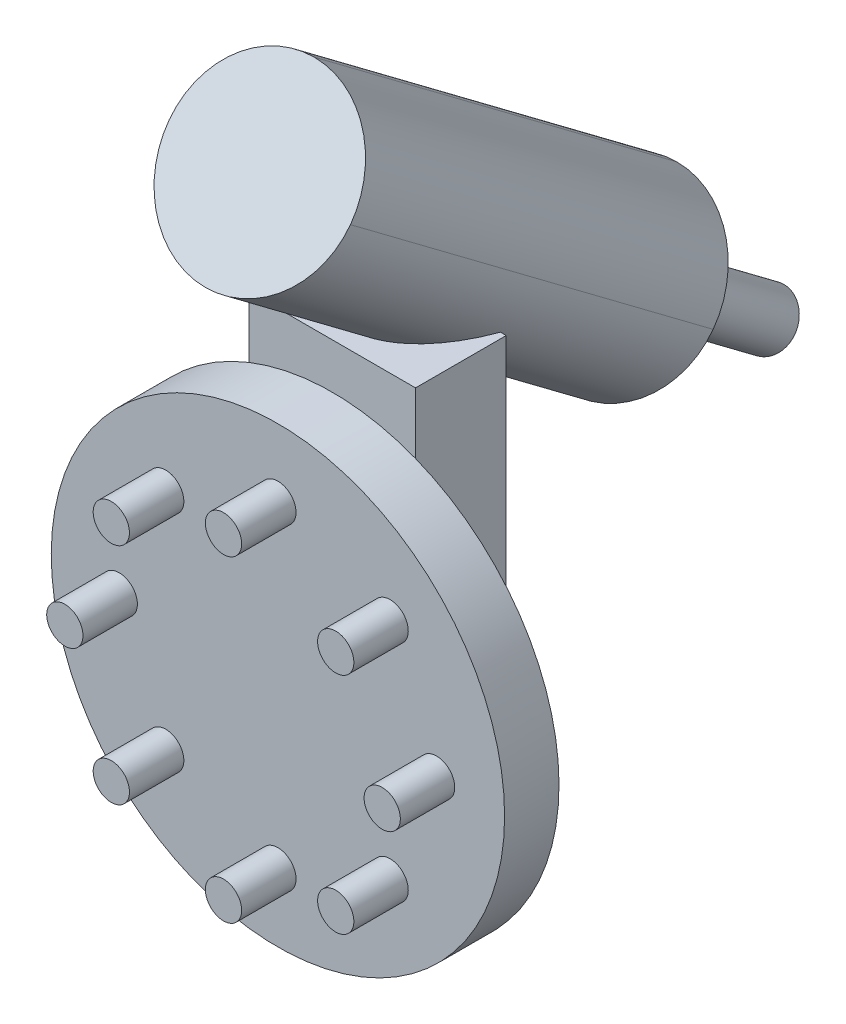
ISO-10303-21;
HEADER;
FILE_DESCRIPTION(('STEP AP214'),'2;1');
FILE_NAME('part.step','',(''),(''),'','','');
FILE_SCHEMA(('AUTOMOTIVE_DESIGN { 1 0 10303 214 1 1 1 1 }'));
ENDSEC;
DATA;
#1=APPLICATION_CONTEXT('core data for automotive mechanical design processes');
#2=APPLICATION_PROTOCOL_DEFINITION('international standard','automotive_design',2000,#1);
#3=PRODUCT_CONTEXT('',#1,'mechanical');
#4=PRODUCT('Part','Part','',(#3));
#5=PRODUCT_RELATED_PRODUCT_CATEGORY('part','',(#4));
#6=PRODUCT_DEFINITION_FORMATION('','',#4);
#7=PRODUCT_DEFINITION_CONTEXT('part definition',#1,'design');
#8=PRODUCT_DEFINITION('design','',#6,#7);
#9=PRODUCT_DEFINITION_SHAPE('','',#8);
#10=(LENGTH_UNIT() NAMED_UNIT(*) SI_UNIT(.MILLI.,.METRE.));
#11=(NAMED_UNIT(*) PLANE_ANGLE_UNIT() SI_UNIT($,.RADIAN.));
#12=(NAMED_UNIT(*) SI_UNIT($,.STERADIAN.) SOLID_ANGLE_UNIT());
#13=UNCERTAINTY_MEASURE_WITH_UNIT(LENGTH_MEASURE(1.E-05),#10,'distance_accuracy_value','');
#14=(GEOMETRIC_REPRESENTATION_CONTEXT(3) GLOBAL_UNCERTAINTY_ASSIGNED_CONTEXT((#13)) GLOBAL_UNIT_ASSIGNED_CONTEXT((#10,
#11,#12)) REPRESENTATION_CONTEXT('',''));
#15=CARTESIAN_POINT('',(0.,0.,0.));
#16=DIRECTION('',(0.,0.,1.));
#17=DIRECTION('',(1.,0.,0.));
#18=AXIS2_PLACEMENT_3D('',#15,#16,#17);
#19=CARTESIAN_POINT('',(0.,0.,0.));
#20=DIRECTION('',(0.,0.,1.));
#21=DIRECTION('',(1.,0.,0.));
#22=AXIS2_PLACEMENT_3D('',#19,#20,#21);
#23=PLANE('',#22);
#24=DIRECTION('',(0.,1.,0.));
#25=VECTOR('',#24,1.);
#26=CARTESIAN_POINT('',(-4.58789080822086,0.,0.));
#27=LINE('',#26,#25);
#28=CARTESIAN_POINT('',(-4.58789080822086,0.,0.));
#29=VERTEX_POINT('',#28);
#30=CARTESIAN_POINT('',(-4.58789080822086,11.6276075755868,0.));
#31=VERTEX_POINT('',#30);
#32=EDGE_CURVE('E160',#29,#31,#27,.T.);
#33=ORIENTED_EDGE('',*,*,#32,.F.);
#34=DIRECTION('',(-1.,0.,0.));
#35=VECTOR('',#34,1.);
#36=CARTESIAN_POINT('',(4.58789080822086,0.,0.));
#37=LINE('',#36,#35);
#38=CARTESIAN_POINT('',(4.58789080822086,0.,0.));
#39=VERTEX_POINT('',#38);
#40=EDGE_CURVE('E172',#39,#29,#37,.T.);
#41=ORIENTED_EDGE('',*,*,#40,.F.);
#42=DIRECTION('',(0.,-1.,0.));
#43=VECTOR('',#42,1.);
#44=CARTESIAN_POINT('',(4.58789080822086,0.,0.));
#45=LINE('',#44,#43);
#46=CARTESIAN_POINT('',(4.58789080822086,11.6276075755868,0.));
#47=VERTEX_POINT('',#46);
#48=EDGE_CURVE('E144',#47,#39,#45,.T.);
#49=ORIENTED_EDGE('',*,*,#48,.F.);
#50=CARTESIAN_POINT('',(0.,0.,0.));
#51=DIRECTION('',(0.,0.,1.));
#52=DIRECTION('',(1.,0.,0.));
#53=AXIS2_PLACEMENT_3D('',#50,#51,#52);
#54=CIRCLE('',#53,12.5);
#55=EDGE_CURVE('E241',#31,#47,#54,.T.);
#56=ORIENTED_EDGE('',*,*,#55,.F.);
#57=EDGE_LOOP('',(#33,#41,#49,#56));
#58=FACE_BOUND('',#57,.T.);
#59=ADVANCED_FACE('F39',(#58),#23,.F.);
#60=CARTESIAN_POINT('',(0.,0.,3.));
#61=DIRECTION('',(0.,0.,-1.));
#62=DIRECTION('',(-1.,0.,0.));
#63=AXIS2_PLACEMENT_3D('',#60,#61,#62);
#64=CYLINDRICAL_SURFACE('',#63,12.5);
#65=CARTESIAN_POINT('',(0.,0.,3.));
#66=DIRECTION('',(0.,0.,1.));
#67=DIRECTION('',(1.,0.,0.));
#68=AXIS2_PLACEMENT_3D('',#65,#66,#67);
#69=CIRCLE('',#68,12.5);
#70=CARTESIAN_POINT('',(12.5,0.,3.));
#71=VERTEX_POINT('',#70);
#72=EDGE_CURVE('E245',#71,#71,#69,.T.);
#73=ORIENTED_EDGE('',*,*,#72,.F.);
#74=EDGE_LOOP('',(#73));
#75=FACE_BOUND('',#74,.T.);
#76=EDGE_CURVE('E249',#47,#31,#54,.T.);
#77=ORIENTED_EDGE('',*,*,#76,.T.);
#78=ORIENTED_EDGE('',*,*,#55,.T.);
#79=EDGE_LOOP('',(#77,#78));
#80=FACE_BOUND('',#79,.T.);
#81=ADVANCED_FACE('F347',(#75,#80),#64,.T.);
#82=CARTESIAN_POINT('',(0.,0.,3.));
#83=DIRECTION('',(0.,0.,1.));
#84=DIRECTION('',(1.,0.,0.));
#85=AXIS2_PLACEMENT_3D('',#82,#83,#84);
#86=PLANE('',#85);
#87=CARTESIAN_POINT('',(-6.18718433538222,6.18718433538212,3.));
#88=DIRECTION('',(0.,0.,1.));
#89=DIRECTION('',(1.,0.,0.));
#90=AXIS2_PLACEMENT_3D('',#87,#88,#89);
#91=CIRCLE('',#90,1.00000000000022);
#92=CARTESIAN_POINT('',(-5.187184335382,6.18718433538212,3.));
#93=VERTEX_POINT('',#92);
#94=EDGE_CURVE('E180',#93,#93,#91,.T.);
#95=ORIENTED_EDGE('',*,*,#94,.F.);
#96=EDGE_LOOP('',(#95));
#97=FACE_BOUND('',#96,.T.);
#98=CARTESIAN_POINT('',(-8.74999999999975,-2.48154174541408E-13,3.));
#99=DIRECTION('',(0.,0.,1.));
#100=DIRECTION('',(1.,0.,0.));
#101=AXIS2_PLACEMENT_3D('',#98,#99,#100);
#102=CIRCLE('',#101,1.0000000000004);
#103=CARTESIAN_POINT('',(-7.74999999999936,-2.48154174541408E-13,3.));
#104=VERTEX_POINT('',#103);
#105=EDGE_CURVE('E185',#104,#104,#102,.T.);
#106=ORIENTED_EDGE('',*,*,#105,.F.);
#107=EDGE_LOOP('',(#106));
#108=FACE_BOUND('',#107,.T.);
#109=CARTESIAN_POINT('',(-6.18718433538187,-6.18718433538247,3.));
#110=DIRECTION('',(0.,0.,1.));
#111=DIRECTION('',(1.,0.,0.));
#112=AXIS2_PLACEMENT_3D('',#109,#110,#111);
#113=CIRCLE('',#112,1.00000000000053);
#114=CARTESIAN_POINT('',(-5.18718433538134,-6.18718433538247,3.));
#115=VERTEX_POINT('',#114);
#116=EDGE_CURVE('E193',#115,#115,#113,.T.);
#117=ORIENTED_EDGE('',*,*,#116,.F.);
#118=EDGE_LOOP('',(#117));
#119=FACE_BOUND('',#118,.T.);
#120=CARTESIAN_POINT('',(4.94165217184309E-13,-8.75,3.));
#121=DIRECTION('',(0.,0.,1.));
#122=DIRECTION('',(1.,0.,0.));
#123=AXIS2_PLACEMENT_3D('',#120,#121,#122);
#124=CIRCLE('',#123,1.00000000000053);
#125=CARTESIAN_POINT('',(1.00000000000103,-8.75,3.));
#126=VERTEX_POINT('',#125);
#127=EDGE_CURVE('E201',#126,#126,#124,.T.);
#128=ORIENTED_EDGE('',*,*,#127,.F.);
#129=EDGE_LOOP('',(#128));
#130=FACE_BOUND('',#129,.T.);
#131=CARTESIAN_POINT('',(6.18718433538271,-6.18718433538212,3.));
#132=DIRECTION('',(0.,0.,1.));
#133=DIRECTION('',(1.,0.,0.));
#134=AXIS2_PLACEMENT_3D('',#131,#132,#133);
#135=CIRCLE('',#134,1.0000000000004);
#136=CARTESIAN_POINT('',(7.18718433538311,-6.18718433538212,3.));
#137=VERTEX_POINT('',#136);
#138=EDGE_CURVE('E209',#137,#137,#135,.T.);
#139=ORIENTED_EDGE('',*,*,#138,.F.);
#140=EDGE_LOOP('',(#139));
#141=FACE_BOUND('',#140,.T.);
#142=CARTESIAN_POINT('',(8.75000000000025,2.47082608592154E-13,3.));
#143=DIRECTION('',(0.,0.,1.));
#144=DIRECTION('',(1.,0.,0.));
#145=AXIS2_PLACEMENT_3D('',#142,#143,#144);
#146=CIRCLE('',#145,1.00000000000019);
#147=CARTESIAN_POINT('',(9.75000000000044,2.47082608592154E-13,3.));
#148=VERTEX_POINT('',#147);
#149=EDGE_CURVE('E217',#148,#148,#146,.T.);
#150=ORIENTED_EDGE('',*,*,#149,.F.);
#151=EDGE_LOOP('',(#150));
#152=FACE_BOUND('',#151,.T.);
#153=CARTESIAN_POINT('',(6.1871843353823,6.18718433538228,3.));
#154=DIRECTION('',(0.,0.,1.));
#155=DIRECTION('',(1.,0.,0.));
#156=AXIS2_PLACEMENT_3D('',#153,#154,#155);
#157=CIRCLE('',#156,1.);
#158=CARTESIAN_POINT('',(7.1871843353823,6.18718433538228,3.));
#159=VERTEX_POINT('',#158);
#160=EDGE_CURVE('E225',#159,#159,#157,.T.);
#161=ORIENTED_EDGE('',*,*,#160,.F.);
#162=EDGE_LOOP('',(#161));
#163=FACE_BOUND('',#162,.T.);
#164=CARTESIAN_POINT('',(0.,8.75,3.));
#165=DIRECTION('',(0.,0.,1.));
#166=DIRECTION('',(1.,0.,0.));
#167=AXIS2_PLACEMENT_3D('',#164,#165,#166);
#168=CIRCLE('',#167,1.);
#169=CARTESIAN_POINT('',(1.,8.75,3.));
#170=VERTEX_POINT('',#169);
#171=EDGE_CURVE('E233',#170,#170,#168,.T.);
#172=ORIENTED_EDGE('',*,*,#171,.F.);
#173=EDGE_LOOP('',(#172));
#174=FACE_BOUND('',#173,.T.);
#175=ORIENTED_EDGE('',*,*,#72,.T.);
#176=EDGE_LOOP('',(#175));
#177=FACE_BOUND('',#176,.T.);
#178=ADVANCED_FACE('F353',(#97,#108,#119,#130,#141,#152,#163,#174,#177),#86,.T.);
#179=CARTESIAN_POINT('',(0.,8.75,6.));
#180=DIRECTION('',(0.,0.,-1.));
#181=DIRECTION('',(-1.,0.,0.));
#182=AXIS2_PLACEMENT_3D('',#179,#180,#181);
#183=CYLINDRICAL_SURFACE('',#182,1.);
#184=CARTESIAN_POINT('',(0.,8.75,6.));
#185=DIRECTION('',(0.,0.,1.));
#186=DIRECTION('',(1.,0.,0.));
#187=AXIS2_PLACEMENT_3D('',#184,#185,#186);
#188=CIRCLE('',#187,1.);
#189=CARTESIAN_POINT('',(1.,8.75,6.));
#190=VERTEX_POINT('',#189);
#191=EDGE_CURVE('E237',#190,#190,#188,.T.);
#192=ORIENTED_EDGE('',*,*,#191,.F.);
#193=EDGE_LOOP('',(#192));
#194=FACE_BOUND('',#193,.T.);
#195=ORIENTED_EDGE('',*,*,#171,.T.);
#196=EDGE_LOOP('',(#195));
#197=FACE_BOUND('',#196,.T.);
#198=ADVANCED_FACE('F358',(#194,#197),#183,.T.);
#199=CARTESIAN_POINT('',(0.,8.75,6.));
#200=DIRECTION('',(0.,0.,1.));
#201=DIRECTION('',(1.,0.,0.));
#202=AXIS2_PLACEMENT_3D('',#199,#200,#201);
#203=PLANE('',#202);
#204=ORIENTED_EDGE('',*,*,#191,.T.);
#205=EDGE_LOOP('',(#204));
#206=FACE_BOUND('',#205,.T.);
#207=ADVANCED_FACE('F362',(#206),#203,.T.);
#208=CARTESIAN_POINT('',(6.1871843353823,6.18718433538228,6.));
#209=DIRECTION('',(0.,0.,-1.));
#210=DIRECTION('',(-1.,0.,0.));
#211=AXIS2_PLACEMENT_3D('',#208,#209,#210);
#212=CYLINDRICAL_SURFACE('',#211,1.);
#213=CARTESIAN_POINT('',(6.1871843353823,6.18718433538228,6.));
#214=DIRECTION('',(0.,0.,1.));
#215=DIRECTION('',(1.,0.,0.));
#216=AXIS2_PLACEMENT_3D('',#213,#214,#215);
#217=CIRCLE('',#216,1.);
#218=CARTESIAN_POINT('',(7.1871843353823,6.18718433538228,6.));
#219=VERTEX_POINT('',#218);
#220=EDGE_CURVE('E229',#219,#219,#217,.T.);
#221=ORIENTED_EDGE('',*,*,#220,.F.);
#222=EDGE_LOOP('',(#221));
#223=FACE_BOUND('',#222,.T.);
#224=ORIENTED_EDGE('',*,*,#160,.T.);
#225=EDGE_LOOP('',(#224));
#226=FACE_BOUND('',#225,.T.);
#227=ADVANCED_FACE('F366',(#223,#226),#212,.T.);
#228=CARTESIAN_POINT('',(6.1871843353823,6.18718433538228,6.));
#229=DIRECTION('',(0.,0.,1.));
#230=DIRECTION('',(1.,0.,0.));
#231=AXIS2_PLACEMENT_3D('',#228,#229,#230);
#232=PLANE('',#231);
#233=ORIENTED_EDGE('',*,*,#220,.T.);
#234=EDGE_LOOP('',(#233));
#235=FACE_BOUND('',#234,.T.);
#236=ADVANCED_FACE('F370',(#235),#232,.T.);
#237=CARTESIAN_POINT('',(8.75000000000025,2.47082608592154E-13,6.));
#238=DIRECTION('',(0.,0.,-1.));
#239=DIRECTION('',(-1.,0.,0.));
#240=AXIS2_PLACEMENT_3D('',#237,#238,#239);
#241=CYLINDRICAL_SURFACE('',#240,1.00000000000019);
#242=CARTESIAN_POINT('',(8.75000000000025,2.47082608592154E-13,6.));
#243=DIRECTION('',(0.,0.,1.));
#244=DIRECTION('',(1.,0.,0.));
#245=AXIS2_PLACEMENT_3D('',#242,#243,#244);
#246=CIRCLE('',#245,1.00000000000019);
#247=CARTESIAN_POINT('',(9.75000000000044,2.47082608592154E-13,6.));
#248=VERTEX_POINT('',#247);
#249=EDGE_CURVE('E221',#248,#248,#246,.T.);
#250=ORIENTED_EDGE('',*,*,#249,.F.);
#251=EDGE_LOOP('',(#250));
#252=FACE_BOUND('',#251,.T.);
#253=ORIENTED_EDGE('',*,*,#149,.T.);
#254=EDGE_LOOP('',(#253));
#255=FACE_BOUND('',#254,.T.);
#256=ADVANCED_FACE('F374',(#252,#255),#241,.T.);
#257=CARTESIAN_POINT('',(8.75000000000025,2.47082608592154E-13,6.));
#258=DIRECTION('',(0.,0.,1.));
#259=DIRECTION('',(1.,0.,0.));
#260=AXIS2_PLACEMENT_3D('',#257,#258,#259);
#261=PLANE('',#260);
#262=ORIENTED_EDGE('',*,*,#249,.T.);
#263=EDGE_LOOP('',(#262));
#264=FACE_BOUND('',#263,.T.);
#265=ADVANCED_FACE('F378',(#264),#261,.T.);
#266=CARTESIAN_POINT('',(6.18718433538271,-6.18718433538212,6.));
#267=DIRECTION('',(0.,0.,-1.));
#268=DIRECTION('',(-1.,0.,0.));
#269=AXIS2_PLACEMENT_3D('',#266,#267,#268);
#270=CYLINDRICAL_SURFACE('',#269,1.0000000000004);
#271=CARTESIAN_POINT('',(6.18718433538271,-6.18718433538212,6.));
#272=DIRECTION('',(0.,0.,1.));
#273=DIRECTION('',(1.,0.,0.));
#274=AXIS2_PLACEMENT_3D('',#271,#272,#273);
#275=CIRCLE('',#274,1.0000000000004);
#276=CARTESIAN_POINT('',(7.18718433538311,-6.18718433538212,6.));
#277=VERTEX_POINT('',#276);
#278=EDGE_CURVE('E213',#277,#277,#275,.T.);
#279=ORIENTED_EDGE('',*,*,#278,.F.);
#280=EDGE_LOOP('',(#279));
#281=FACE_BOUND('',#280,.T.);
#282=ORIENTED_EDGE('',*,*,#138,.T.);
#283=EDGE_LOOP('',(#282));
#284=FACE_BOUND('',#283,.T.);
#285=ADVANCED_FACE('F382',(#281,#284),#270,.T.);
#286=CARTESIAN_POINT('',(6.18718433538271,-6.18718433538212,6.));
#287=DIRECTION('',(0.,0.,1.));
#288=DIRECTION('',(1.,0.,0.));
#289=AXIS2_PLACEMENT_3D('',#286,#287,#288);
#290=PLANE('',#289);
#291=ORIENTED_EDGE('',*,*,#278,.T.);
#292=EDGE_LOOP('',(#291));
#293=FACE_BOUND('',#292,.T.);
#294=ADVANCED_FACE('F386',(#293),#290,.T.);
#295=CARTESIAN_POINT('',(4.94165217184309E-13,-8.75,6.));
#296=DIRECTION('',(0.,0.,-1.));
#297=DIRECTION('',(-1.,0.,0.));
#298=AXIS2_PLACEMENT_3D('',#295,#296,#297);
#299=CYLINDRICAL_SURFACE('',#298,1.00000000000053);
#300=CARTESIAN_POINT('',(4.94165217184309E-13,-8.75,6.));
#301=DIRECTION('',(0.,0.,1.));
#302=DIRECTION('',(1.,0.,0.));
#303=AXIS2_PLACEMENT_3D('',#300,#301,#302);
#304=CIRCLE('',#303,1.00000000000053);
#305=CARTESIAN_POINT('',(1.00000000000103,-8.75,6.));
#306=VERTEX_POINT('',#305);
#307=EDGE_CURVE('E205',#306,#306,#304,.T.);
#308=ORIENTED_EDGE('',*,*,#307,.F.);
#309=EDGE_LOOP('',(#308));
#310=FACE_BOUND('',#309,.T.);
#311=ORIENTED_EDGE('',*,*,#127,.T.);
#312=EDGE_LOOP('',(#311));
#313=FACE_BOUND('',#312,.T.);
#314=ADVANCED_FACE('F390',(#310,#313),#299,.T.);
#315=CARTESIAN_POINT('',(4.94165217184309E-13,-8.75,6.));
#316=DIRECTION('',(0.,0.,1.));
#317=DIRECTION('',(1.,0.,0.));
#318=AXIS2_PLACEMENT_3D('',#315,#316,#317);
#319=PLANE('',#318);
#320=ORIENTED_EDGE('',*,*,#307,.T.);
#321=EDGE_LOOP('',(#320));
#322=FACE_BOUND('',#321,.T.);
#323=ADVANCED_FACE('F394',(#322),#319,.T.);
#324=CARTESIAN_POINT('',(-6.18718433538187,-6.18718433538247,6.));
#325=DIRECTION('',(0.,0.,-1.));
#326=DIRECTION('',(-1.,0.,0.));
#327=AXIS2_PLACEMENT_3D('',#324,#325,#326);
#328=CYLINDRICAL_SURFACE('',#327,1.00000000000053);
#329=CARTESIAN_POINT('',(-6.18718433538187,-6.18718433538247,6.));
#330=DIRECTION('',(0.,0.,1.));
#331=DIRECTION('',(1.,0.,0.));
#332=AXIS2_PLACEMENT_3D('',#329,#330,#331);
#333=CIRCLE('',#332,1.00000000000053);
#334=CARTESIAN_POINT('',(-5.18718433538134,-6.18718433538247,6.));
#335=VERTEX_POINT('',#334);
#336=EDGE_CURVE('E197',#335,#335,#333,.T.);
#337=ORIENTED_EDGE('',*,*,#336,.F.);
#338=EDGE_LOOP('',(#337));
#339=FACE_BOUND('',#338,.T.);
#340=ORIENTED_EDGE('',*,*,#116,.T.);
#341=EDGE_LOOP('',(#340));
#342=FACE_BOUND('',#341,.T.);
#343=ADVANCED_FACE('F398',(#339,#342),#328,.T.);
#344=CARTESIAN_POINT('',(-6.18718433538187,-6.18718433538247,6.));
#345=DIRECTION('',(0.,0.,1.));
#346=DIRECTION('',(1.,0.,0.));
#347=AXIS2_PLACEMENT_3D('',#344,#345,#346);
#348=PLANE('',#347);
#349=ORIENTED_EDGE('',*,*,#336,.T.);
#350=EDGE_LOOP('',(#349));
#351=FACE_BOUND('',#350,.T.);
#352=ADVANCED_FACE('F402',(#351),#348,.T.);
#353=CARTESIAN_POINT('',(-8.74999999999975,-2.48154174541408E-13,6.));
#354=DIRECTION('',(0.,0.,-1.));
#355=DIRECTION('',(-1.,0.,0.));
#356=AXIS2_PLACEMENT_3D('',#353,#354,#355);
#357=CYLINDRICAL_SURFACE('',#356,1.0000000000004);
#358=CARTESIAN_POINT('',(-8.74999999999975,-2.48154174541408E-13,6.));
#359=DIRECTION('',(0.,0.,1.));
#360=DIRECTION('',(1.,0.,0.));
#361=AXIS2_PLACEMENT_3D('',#358,#359,#360);
#362=CIRCLE('',#361,1.0000000000004);
#363=CARTESIAN_POINT('',(-7.74999999999936,-2.48154174541408E-13,6.));
#364=VERTEX_POINT('',#363);
#365=EDGE_CURVE('E189',#364,#364,#362,.T.);
#366=ORIENTED_EDGE('',*,*,#365,.F.);
#367=EDGE_LOOP('',(#366));
#368=FACE_BOUND('',#367,.T.);
#369=ORIENTED_EDGE('',*,*,#105,.T.);
#370=EDGE_LOOP('',(#369));
#371=FACE_BOUND('',#370,.T.);
#372=ADVANCED_FACE('F406',(#368,#371),#357,.T.);
#373=CARTESIAN_POINT('',(-8.74999999999975,-2.48154174541408E-13,6.));
#374=DIRECTION('',(0.,0.,1.));
#375=DIRECTION('',(1.,0.,0.));
#376=AXIS2_PLACEMENT_3D('',#373,#374,#375);
#377=PLANE('',#376);
#378=ORIENTED_EDGE('',*,*,#365,.T.);
#379=EDGE_LOOP('',(#378));
#380=FACE_BOUND('',#379,.T.);
#381=ADVANCED_FACE('F410',(#380),#377,.T.);
#382=CARTESIAN_POINT('',(-6.18718433538222,6.18718433538212,6.));
#383=DIRECTION('',(0.,0.,-1.));
#384=DIRECTION('',(-1.,0.,0.));
#385=AXIS2_PLACEMENT_3D('',#382,#383,#384);
#386=CYLINDRICAL_SURFACE('',#385,1.00000000000022);
#387=CARTESIAN_POINT('',(-6.18718433538222,6.18718433538212,6.));
#388=DIRECTION('',(0.,0.,1.));
#389=DIRECTION('',(1.,0.,0.));
#390=AXIS2_PLACEMENT_3D('',#387,#388,#389);
#391=CIRCLE('',#390,1.00000000000022);
#392=CARTESIAN_POINT('',(-5.187184335382,6.18718433538212,6.));
#393=VERTEX_POINT('',#392);
#394=EDGE_CURVE('E181',#393,#393,#391,.T.);
#395=ORIENTED_EDGE('',*,*,#394,.F.);
#396=EDGE_LOOP('',(#395));
#397=FACE_BOUND('',#396,.T.);
#398=ORIENTED_EDGE('',*,*,#94,.T.);
#399=EDGE_LOOP('',(#398));
#400=FACE_BOUND('',#399,.T.);
#401=ADVANCED_FACE('F414',(#397,#400),#386,.T.);
#402=CARTESIAN_POINT('',(-6.18718433538222,6.18718433538212,6.));
#403=DIRECTION('',(0.,0.,1.));
#404=DIRECTION('',(1.,0.,0.));
#405=AXIS2_PLACEMENT_3D('',#402,#403,#404);
#406=PLANE('',#405);
#407=ORIENTED_EDGE('',*,*,#394,.T.);
#408=EDGE_LOOP('',(#407));
#409=FACE_BOUND('',#408,.T.);
#410=ADVANCED_FACE('F418',(#409),#406,.T.);
#411=CARTESIAN_POINT('',(0.,0.,0.));
#412=DIRECTION('',(0.,0.,1.));
#413=DIRECTION('',(1.,0.,0.));
#414=AXIS2_PLACEMENT_3D('',#411,#412,#413);
#415=PLANE('',#414);
#416=ORIENTED_EDGE('',*,*,#76,.F.);
#417=CARTESIAN_POINT('',(4.58789080822086,15.,0.));
#418=VERTEX_POINT('',#417);
#419=EDGE_CURVE('E169',#418,#47,#45,.T.);
#420=ORIENTED_EDGE('',*,*,#419,.F.);
#421=DIRECTION('',(1.,0.,0.));
#422=VECTOR('',#421,1.);
#423=CARTESIAN_POINT('',(4.58789080822086,15.,0.));
#424=LINE('',#423,#422);
#425=CARTESIAN_POINT('',(-4.58789080822086,15.,0.));
#426=VERTEX_POINT('',#425);
#427=EDGE_CURVE('E164',#426,#418,#424,.T.);
#428=ORIENTED_EDGE('',*,*,#427,.F.);
#429=EDGE_CURVE('E165',#31,#426,#27,.T.);
#430=ORIENTED_EDGE('',*,*,#429,.F.);
#431=EDGE_LOOP('',(#416,#420,#428,#430));
#432=FACE_BOUND('',#431,.T.);
#433=ADVANCED_FACE('F325',(#432),#415,.T.);
#434=CARTESIAN_POINT('',(-4.58789080822086,0.,-5.));
#435=DIRECTION('',(1.,0.,0.));
#436=DIRECTION('',(0.,1.,0.));
#437=AXIS2_PLACEMENT_3D('',#434,#435,#436);
#438=PLANE('',#437);
#439=DIRECTION('',(0.,0.,1.));
#440=VECTOR('',#439,1.);
#441=CARTESIAN_POINT('',(-4.58789080822086,15.,-5.));
#442=LINE('',#441,#440);
#443=CARTESIAN_POINT('',(-4.58789080822086,15.,-5.));
#444=VERTEX_POINT('',#443);
#445=EDGE_CURVE('E177',#444,#426,#442,.T.);
#446=ORIENTED_EDGE('',*,*,#445,.F.);
#447=DIRECTION('',(0.,1.,0.));
#448=VECTOR('',#447,1.);
#449=CARTESIAN_POINT('',(-4.58789080822086,0.,-5.));
#450=LINE('',#449,#448);
#451=CARTESIAN_POINT('',(-4.58789080822086,0.,-5.));
#452=VERTEX_POINT('',#451);
#453=EDGE_CURVE('E137',#452,#444,#450,.T.);
#454=ORIENTED_EDGE('',*,*,#453,.F.);
#455=DIRECTION('',(0.,0.,1.));
#456=VECTOR('',#455,1.);
#457=CARTESIAN_POINT('',(-4.58789080822086,0.,-5.));
#458=LINE('',#457,#456);
#459=EDGE_CURVE('E149',#452,#29,#458,.T.);
#460=ORIENTED_EDGE('',*,*,#459,.T.);
#461=ORIENTED_EDGE('',*,*,#32,.T.);
#462=ORIENTED_EDGE('',*,*,#429,.T.);
#463=EDGE_LOOP('',(#446,#454,#460,#461,#462));
#464=FACE_BOUND('',#463,.T.);
#465=ADVANCED_FACE('F321',(#464),#438,.F.);
#466=CARTESIAN_POINT('',(4.58789080822086,15.,-5.));
#467=DIRECTION('',(0.,-1.,0.));
#468=DIRECTION('',(1.,0.,0.));
#469=AXIS2_PLACEMENT_3D('',#466,#467,#468);
#470=PLANE('',#469);
#471=DIRECTION('',(0.,0.,1.));
#472=VECTOR('',#471,1.);
#473=CARTESIAN_POINT('',(4.58789080822086,15.,-5.));
#474=LINE('',#473,#472);
#475=CARTESIAN_POINT('',(4.58789080822086,15.,-5.));
#476=VERTEX_POINT('',#475);
#477=EDGE_CURVE('E148',#476,#418,#474,.T.);
#478=ORIENTED_EDGE('',*,*,#477,.F.);
#479=DIRECTION('',(-1.,0.,0.));
#480=VECTOR('',#479,1.);
#481=CARTESIAN_POINT('',(4.58789080822086,15.,-5.));
#482=LINE('',#481,#480);
#483=CARTESIAN_POINT('',(4.27083130081252,15.,-5.));
#484=VERTEX_POINT('',#483);
#485=EDGE_CURVE('E134',#476,#484,#482,.T.);
#486=ORIENTED_EDGE('',*,*,#485,.T.);
#487=CARTESIAN_POINT('',(0.,15.,-9.33333333333334));
#488=DIRECTION('',(0.,-1.,0.));
#489=DIRECTION('',(0.,0.,1.));
#490=AXIS2_PLACEMENT_3D('',#487,#488,#489);
#491=ELLIPSE('',#490,8.33333333333333,5.);
#492=CARTESIAN_POINT('',(0.,15.,-1.));
#493=VERTEX_POINT('',#492);
#494=EDGE_CURVE('E64',#484,#493,#491,.T.);
#495=ORIENTED_EDGE('',*,*,#494,.T.);
#496=CARTESIAN_POINT('',(0.,15.,-9.33333333333334));
#497=DIRECTION('',(0.,-1.,0.));
#498=DIRECTION('',(0.,0.,-1.));
#499=AXIS2_PLACEMENT_3D('',#496,#497,#498);
#500=ELLIPSE('',#499,8.33333333333333,5.);
#501=CARTESIAN_POINT('',(-4.27083130081252,15.,-5.));
#502=VERTEX_POINT('',#501);
#503=EDGE_CURVE('E57',#493,#502,#500,.T.);
#504=ORIENTED_EDGE('',*,*,#503,.T.);
#505=DIRECTION('',(1.,0.,0.));
#506=VECTOR('',#505,1.);
#507=CARTESIAN_POINT('',(0.,15.,-5.));
#508=LINE('',#507,#506);
#509=EDGE_CURVE('E49',#444,#502,#508,.T.);
#510=ORIENTED_EDGE('',*,*,#509,.F.);
#511=ORIENTED_EDGE('',*,*,#445,.T.);
#512=ORIENTED_EDGE('',*,*,#427,.T.);
#513=EDGE_LOOP('',(#478,#486,#495,#504,#510,#511,#512));
#514=FACE_BOUND('',#513,.T.);
#515=ADVANCED_FACE('F326',(#514),#470,.F.);
#516=CARTESIAN_POINT('',(4.58789080822086,0.,-5.));
#517=DIRECTION('',(-1.,0.,0.));
#518=DIRECTION('',(0.,0.,1.));
#519=AXIS2_PLACEMENT_3D('',#516,#517,#518);
#520=PLANE('',#519);
#521=DIRECTION('',(0.,-1.,0.));
#522=VECTOR('',#521,1.);
#523=CARTESIAN_POINT('',(4.58789080822086,0.,-5.));
#524=LINE('',#523,#522);
#525=CARTESIAN_POINT('',(4.58789080822086,0.,-5.));
#526=VERTEX_POINT('',#525);
#527=EDGE_CURVE('E127',#476,#526,#524,.T.);
#528=ORIENTED_EDGE('',*,*,#527,.F.);
#529=ORIENTED_EDGE('',*,*,#477,.T.);
#530=ORIENTED_EDGE('',*,*,#419,.T.);
#531=ORIENTED_EDGE('',*,*,#48,.T.);
#532=DIRECTION('',(0.,0.,1.));
#533=VECTOR('',#532,1.);
#534=CARTESIAN_POINT('',(4.58789080822086,0.,-5.));
#535=LINE('',#534,#533);
#536=EDGE_CURVE('E141',#526,#39,#535,.T.);
#537=ORIENTED_EDGE('',*,*,#536,.F.);
#538=EDGE_LOOP('',(#528,#529,#530,#531,#537));
#539=FACE_BOUND('',#538,.T.);
#540=ADVANCED_FACE('F142',(#539),#520,.F.);
#541=CARTESIAN_POINT('',(4.58789080822086,0.,-5.));
#542=DIRECTION('',(0.,1.,0.));
#543=DIRECTION('',(-1.,0.,0.));
#544=AXIS2_PLACEMENT_3D('',#541,#542,#543);
#545=PLANE('',#544);
#546=ORIENTED_EDGE('',*,*,#40,.T.);
#547=ORIENTED_EDGE('',*,*,#459,.F.);
#548=DIRECTION('',(-1.,0.,0.));
#549=VECTOR('',#548,1.);
#550=CARTESIAN_POINT('',(4.58789080822086,0.,-5.));
#551=LINE('',#550,#549);
#552=EDGE_CURVE('E131',#526,#452,#551,.T.);
#553=ORIENTED_EDGE('',*,*,#552,.F.);
#554=ORIENTED_EDGE('',*,*,#536,.T.);
#555=EDGE_LOOP('',(#546,#547,#553,#554));
#556=FACE_BOUND('',#555,.T.);
#557=ADVANCED_FACE('F151',(#556),#545,.F.);
#558=CARTESIAN_POINT('',(0.,0.,-5.));
#559=DIRECTION('',(0.,0.,1.));
#560=DIRECTION('',(1.,0.,0.));
#561=AXIS2_PLACEMENT_3D('',#558,#559,#560);
#562=PLANE('',#561);
#563=ORIENTED_EDGE('',*,*,#453,.T.);
#564=ORIENTED_EDGE('',*,*,#509,.T.);
#565=CARTESIAN_POINT('',(0.,18.25,-5.));
#566=DIRECTION('',(0.,0.,1.));
#567=DIRECTION('',(0.,-1.,0.));
#568=AXIS2_PLACEMENT_3D('',#565,#566,#567);
#569=ELLIPSE('',#568,6.25,5.);
#570=CARTESIAN_POINT('',(0.,12.,-5.));
#571=VERTEX_POINT('',#570);
#572=EDGE_CURVE('E286',#502,#571,#569,.T.);
#573=ORIENTED_EDGE('',*,*,#572,.T.);
#574=CARTESIAN_POINT('',(0.,18.25,-5.));
#575=DIRECTION('',(0.,0.,1.));
#576=DIRECTION('',(0.,1.,0.));
#577=AXIS2_PLACEMENT_3D('',#574,#575,#576);
#578=ELLIPSE('',#577,6.25,5.);
#579=EDGE_CURVE('E279',#571,#484,#578,.T.);
#580=ORIENTED_EDGE('',*,*,#579,.T.);
#581=ORIENTED_EDGE('',*,*,#485,.F.);
#582=ORIENTED_EDGE('',*,*,#527,.T.);
#583=ORIENTED_EDGE('',*,*,#552,.T.);
#584=EDGE_LOOP('',(#563,#564,#573,#580,#581,#582,#583));
#585=FACE_BOUND('',#584,.T.);
#586=ADVANCED_FACE('F129',(#585),#562,.F.);
#587=CARTESIAN_POINT('',(-5.,14.,-19.));
#588=DIRECTION('',(0.,0.6,0.8));
#589=DIRECTION('',(0.,-0.8,0.6));
#590=AXIS2_PLACEMENT_3D('',#587,#588,#589);
#591=PLANE('',#590);
#592=CARTESIAN_POINT('',(0.,10.,-16.));
#593=DIRECTION('',(0.,-0.6,-0.8));
#594=DIRECTION('',(0.,0.8,-0.6));
#595=AXIS2_PLACEMENT_3D('',#592,#593,#594);
#596=CIRCLE('',#595,1.5);
#597=CARTESIAN_POINT('',(0.,11.2,-16.9));
#598=VERTEX_POINT('',#597);
#599=EDGE_CURVE('E11',#598,#598,#596,.T.);
#600=ORIENTED_EDGE('',*,*,#599,.F.);
#601=EDGE_LOOP('',(#600));
#602=FACE_BOUND('',#601,.T.);
#603=CARTESIAN_POINT('',(0.,10.,-16.));
#604=DIRECTION('',(0.,0.6,0.8));
#605=DIRECTION('',(0.,-0.8,0.6));
#606=AXIS2_PLACEMENT_3D('',#603,#604,#605);
#607=CIRCLE('',#606,5.);
#608=CARTESIAN_POINT('',(0.,14.,-19.));
#609=VERTEX_POINT('',#608);
#610=CARTESIAN_POINT('',(5.,10.,-16.));
#611=VERTEX_POINT('',#610);
#612=EDGE_CURVE('E253',#609,#611,#607,.F.);
#613=ORIENTED_EDGE('',*,*,#612,.T.);
#614=CARTESIAN_POINT('',(0.,10.,-16.));
#615=DIRECTION('',(0.,0.6,0.8));
#616=DIRECTION('',(0.,-0.8,0.6));
#617=AXIS2_PLACEMENT_3D('',#614,#615,#616);
#618=CIRCLE('',#617,5.);
#619=CARTESIAN_POINT('',(0.,6.,-13.));
#620=VERTEX_POINT('',#619);
#621=EDGE_CURVE('E262',#611,#620,#618,.F.);
#622=ORIENTED_EDGE('',*,*,#621,.T.);
#623=CARTESIAN_POINT('',(0.,10.,-16.));
#624=DIRECTION('',(0.,0.6,0.8));
#625=DIRECTION('',(0.,-0.8,0.6));
#626=AXIS2_PLACEMENT_3D('',#623,#624,#625);
#627=CIRCLE('',#626,5.);
#628=CARTESIAN_POINT('',(-5.,10.,-16.));
#629=VERTEX_POINT('',#628);
#630=EDGE_CURVE('E259',#620,#629,#627,.F.);
#631=ORIENTED_EDGE('',*,*,#630,.T.);
#632=CARTESIAN_POINT('',(0.,10.,-16.));
#633=DIRECTION('',(0.,0.6,0.8));
#634=DIRECTION('',(0.,-0.8,0.6));
#635=AXIS2_PLACEMENT_3D('',#632,#633,#634);
#636=CIRCLE('',#635,5.);
#637=EDGE_CURVE('E256',#629,#609,#636,.F.);
#638=ORIENTED_EDGE('',*,*,#637,.T.);
#639=EDGE_LOOP('',(#613,#622,#631,#638));
#640=FACE_BOUND('',#639,.T.);
#641=ADVANCED_FACE('F435',(#602,#640),#591,.F.);
#642=CARTESIAN_POINT('',(-5.,29.,0.999999999999994));
#643=DIRECTION('',(0.,-0.6,-0.8));
#644=DIRECTION('',(0.,0.8,-0.6));
#645=AXIS2_PLACEMENT_3D('',#642,#643,#644);
#646=PLANE('',#645);
#647=CARTESIAN_POINT('',(0.,25.,4.));
#648=DIRECTION('',(0.,-0.6,-0.8));
#649=DIRECTION('',(0.,0.8,-0.6));
#650=AXIS2_PLACEMENT_3D('',#647,#648,#649);
#651=CIRCLE('',#650,5.);
#652=CARTESIAN_POINT('',(-5.,25.,3.99999999999999));
#653=VERTEX_POINT('',#652);
#654=CARTESIAN_POINT('',(0.,21.,6.99999999999999));
#655=VERTEX_POINT('',#654);
#656=EDGE_CURVE('E272',#653,#655,#651,.F.);
#657=ORIENTED_EDGE('',*,*,#656,.T.);
#658=CARTESIAN_POINT('',(0.,25.,4.));
#659=DIRECTION('',(0.,-0.6,-0.8));
#660=DIRECTION('',(0.,0.8,-0.6));
#661=AXIS2_PLACEMENT_3D('',#658,#659,#660);
#662=CIRCLE('',#661,5.);
#663=CARTESIAN_POINT('',(5.,25.,3.99999999999999));
#664=VERTEX_POINT('',#663);
#665=EDGE_CURVE('E275',#655,#664,#662,.F.);
#666=ORIENTED_EDGE('',*,*,#665,.T.);
#667=CARTESIAN_POINT('',(0.,25.,3.99999999999999));
#668=DIRECTION('',(0.,-0.6,-0.8));
#669=DIRECTION('',(0.,0.8,-0.6));
#670=AXIS2_PLACEMENT_3D('',#667,#668,#669);
#671=CIRCLE('',#670,5.);
#672=CARTESIAN_POINT('',(0.,29.,0.999999999999994));
#673=VERTEX_POINT('',#672);
#674=EDGE_CURVE('E266',#664,#673,#671,.F.);
#675=ORIENTED_EDGE('',*,*,#674,.T.);
#676=CARTESIAN_POINT('',(0.,25.,3.99999999999999));
#677=DIRECTION('',(0.,-0.6,-0.8));
#678=DIRECTION('',(0.,0.8,-0.6));
#679=AXIS2_PLACEMENT_3D('',#676,#677,#678);
#680=CIRCLE('',#679,5.);
#681=EDGE_CURVE('E269',#673,#653,#680,.F.);
#682=ORIENTED_EDGE('',*,*,#681,.T.);
#683=EDGE_LOOP('',(#657,#666,#675,#682));
#684=FACE_BOUND('',#683,.T.);
#685=ADVANCED_FACE('F438',(#684),#646,.F.);
#686=CARTESIAN_POINT('',(0.,14.08,-10.56));
#687=DIRECTION('',(0.,0.6,0.8));
#688=DIRECTION('',(0.,-0.8,0.6));
#689=AXIS2_PLACEMENT_3D('',#686,#687,#688);
#690=CYLINDRICAL_SURFACE('',#689,5.);
#691=DIRECTION('',(0.,0.6,0.8));
#692=VECTOR('',#691,1.);
#693=CARTESIAN_POINT('',(0.,18.08,-13.56));
#694=LINE('',#693,#692);
#695=EDGE_CURVE('E302',#609,#673,#694,.T.);
#696=ORIENTED_EDGE('',*,*,#695,.F.);
#697=ORIENTED_EDGE('',*,*,#637,.F.);
#698=DIRECTION('',(0.,0.6,0.8));
#699=VECTOR('',#698,1.);
#700=CARTESIAN_POINT('',(-5.,25.,3.99999999999999));
#701=LINE('',#700,#699);
#702=EDGE_CURVE('E43',#653,#629,#701,.F.);
#703=ORIENTED_EDGE('',*,*,#702,.F.);
#704=ORIENTED_EDGE('',*,*,#681,.F.);
#705=EDGE_LOOP('',(#696,#697,#703,#704));
#706=FACE_BOUND('',#705,.T.);
#707=ADVANCED_FACE('F41',(#706),#690,.T.);
#708=CARTESIAN_POINT('',(0.,25.,3.99999999999999));
#709=DIRECTION('',(0.,-0.6,-0.8));
#710=DIRECTION('',(0.,0.8,-0.6));
#711=AXIS2_PLACEMENT_3D('',#708,#709,#710);
#712=CYLINDRICAL_SURFACE('',#711,5.);
#713=ORIENTED_EDGE('',*,*,#702,.T.);
#714=ORIENTED_EDGE('',*,*,#630,.F.);
#715=DIRECTION('',(0.,0.6,0.8));
#716=VECTOR('',#715,1.);
#717=CARTESIAN_POINT('',(0.,6.00000000000001,-13.));
#718=LINE('',#717,#716);
#719=EDGE_CURVE('E300',#571,#620,#718,.F.);
#720=ORIENTED_EDGE('',*,*,#719,.F.);
#721=ORIENTED_EDGE('',*,*,#572,.F.);
#722=ORIENTED_EDGE('',*,*,#503,.F.);
#723=DIRECTION('',(0.,0.6,0.8));
#724=VECTOR('',#723,1.);
#725=CARTESIAN_POINT('',(0.,6.00000000000001,-13.));
#726=LINE('',#725,#724);
#727=EDGE_CURVE('E296',#655,#493,#726,.F.);
#728=ORIENTED_EDGE('',*,*,#727,.F.);
#729=ORIENTED_EDGE('',*,*,#656,.F.);
#730=EDGE_LOOP('',(#713,#714,#720,#721,#722,#728,#729));
#731=FACE_BOUND('',#730,.T.);
#732=ADVANCED_FACE('F329',(#731),#712,.T.);
#733=CARTESIAN_POINT('',(0.,14.08,-10.56));
#734=DIRECTION('',(0.,-0.6,-0.8));
#735=DIRECTION('',(0.,0.8,-0.6));
#736=AXIS2_PLACEMENT_3D('',#733,#734,#735);
#737=CYLINDRICAL_SURFACE('',#736,5.);
#738=ORIENTED_EDGE('',*,*,#695,.T.);
#739=ORIENTED_EDGE('',*,*,#674,.F.);
#740=DIRECTION('',(0.,-0.6,-0.8));
#741=VECTOR('',#740,1.);
#742=CARTESIAN_POINT('',(5.,25.,3.99999999999999));
#743=LINE('',#742,#741);
#744=EDGE_CURVE('E293',#611,#664,#743,.F.);
#745=ORIENTED_EDGE('',*,*,#744,.F.);
#746=ORIENTED_EDGE('',*,*,#612,.F.);
#747=EDGE_LOOP('',(#738,#739,#745,#746));
#748=FACE_BOUND('',#747,.T.);
#749=ADVANCED_FACE('F335',(#748),#737,.T.);
#750=CARTESIAN_POINT('',(0.,25.,3.99999999999999));
#751=DIRECTION('',(0.,0.6,0.8));
#752=DIRECTION('',(0.,-0.8,0.6));
#753=AXIS2_PLACEMENT_3D('',#750,#751,#752);
#754=CYLINDRICAL_SURFACE('',#753,5.);
#755=ORIENTED_EDGE('',*,*,#579,.F.);
#756=ORIENTED_EDGE('',*,*,#719,.T.);
#757=ORIENTED_EDGE('',*,*,#621,.F.);
#758=ORIENTED_EDGE('',*,*,#744,.T.);
#759=ORIENTED_EDGE('',*,*,#665,.F.);
#760=ORIENTED_EDGE('',*,*,#727,.T.);
#761=ORIENTED_EDGE('',*,*,#494,.F.);
#762=EDGE_LOOP('',(#755,#756,#757,#758,#759,#760,#761));
#763=FACE_BOUND('',#762,.T.);
#764=ADVANCED_FACE('F332',(#763),#754,.T.);
#765=CARTESIAN_POINT('',(0.,4.,-24.));
#766=DIRECTION('',(0.,0.6,0.8));
#767=DIRECTION('',(0.,-0.8,0.6));
#768=AXIS2_PLACEMENT_3D('',#765,#766,#767);
#769=CYLINDRICAL_SURFACE('',#768,1.5);
#770=CARTESIAN_POINT('',(0.,4.,-24.));
#771=DIRECTION('',(0.,-0.6,-0.8));
#772=DIRECTION('',(0.,0.8,-0.6));
#773=AXIS2_PLACEMENT_3D('',#770,#771,#772);
#774=CIRCLE('',#773,1.5);
#775=CARTESIAN_POINT('',(0.,5.2,-24.9));
#776=VERTEX_POINT('',#775);
#777=EDGE_CURVE('E297',#776,#776,#774,.T.);
#778=ORIENTED_EDGE('',*,*,#777,.F.);
#779=EDGE_LOOP('',(#778));
#780=FACE_BOUND('',#779,.T.);
#781=ORIENTED_EDGE('',*,*,#599,.T.);
#782=EDGE_LOOP('',(#781));
#783=FACE_BOUND('',#782,.T.);
#784=ADVANCED_FACE('F334',(#780,#783),#769,.T.);
#785=CARTESIAN_POINT('',(0.,4.,-24.));
#786=DIRECTION('',(0.,-0.6,-0.8));
#787=DIRECTION('',(0.,0.8,-0.6));
#788=AXIS2_PLACEMENT_3D('',#785,#786,#787);
#789=PLANE('',#788);
#790=ORIENTED_EDGE('',*,*,#777,.T.);
#791=EDGE_LOOP('',(#790));
#792=FACE_BOUND('',#791,.T.);
#793=ADVANCED_FACE('F341',(#792),#789,.T.);
#794=CLOSED_SHELL('',(#59,#81,#178,#198,#207,#227,#236,#256,#265,#285,#294,#314,#323,#343,#352,
#372,#381,#401,#410,#433,#465,#515,#540,#557,#586,#641,#685,#707,#732,#749,#764,#784,#793));
#795=MANIFOLD_SOLID_BREP('B2',#794);
#796=ADVANCED_BREP_SHAPE_REPRESENTATION('',(#18,#795),#14);
#797=SHAPE_DEFINITION_REPRESENTATION(#9,#796);
ENDSEC;
END-ISO-10303-21;
